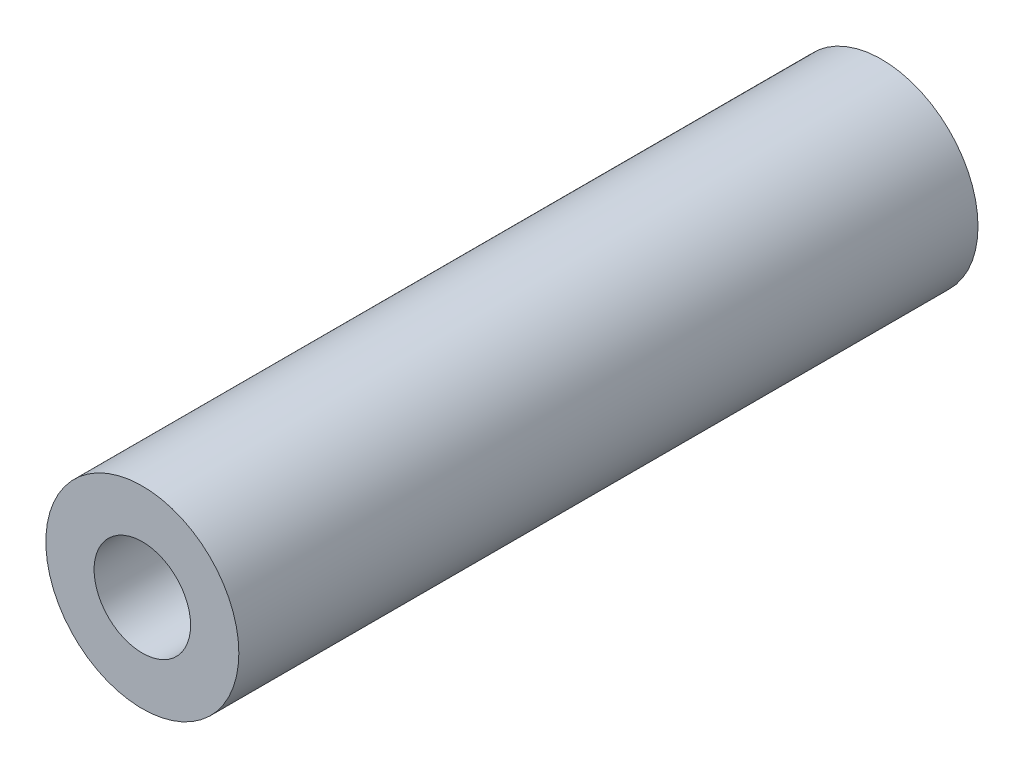
ISO-10303-21;
HEADER;
FILE_DESCRIPTION(('STEP AP214'),'2;1');
FILE_NAME('part.step','',(''),(''),'','','');
FILE_SCHEMA(('AUTOMOTIVE_DESIGN { 1 0 10303 214 1 1 1 1 }'));
ENDSEC;
DATA;
#1=APPLICATION_CONTEXT('core data for automotive mechanical design processes');
#2=APPLICATION_PROTOCOL_DEFINITION('international standard','automotive_design',2000,#1);
#3=PRODUCT_CONTEXT('',#1,'mechanical');
#4=PRODUCT('Part','Part','',(#3));
#5=PRODUCT_RELATED_PRODUCT_CATEGORY('part','',(#4));
#6=PRODUCT_DEFINITION_FORMATION('','',#4);
#7=PRODUCT_DEFINITION_CONTEXT('part definition',#1,'design');
#8=PRODUCT_DEFINITION('design','',#6,#7);
#9=PRODUCT_DEFINITION_SHAPE('','',#8);
#10=(LENGTH_UNIT() NAMED_UNIT(*) SI_UNIT(.MILLI.,.METRE.));
#11=(NAMED_UNIT(*) PLANE_ANGLE_UNIT() SI_UNIT($,.RADIAN.));
#12=(NAMED_UNIT(*) SI_UNIT($,.STERADIAN.) SOLID_ANGLE_UNIT());
#13=UNCERTAINTY_MEASURE_WITH_UNIT(LENGTH_MEASURE(1.E-05),#10,'distance_accuracy_value','');
#14=(GEOMETRIC_REPRESENTATION_CONTEXT(3) GLOBAL_UNCERTAINTY_ASSIGNED_CONTEXT((#13)) GLOBAL_UNIT_ASSIGNED_CONTEXT((#10,
#11,#12)) REPRESENTATION_CONTEXT('',''));
#15=CARTESIAN_POINT('',(0.,0.,0.));
#16=DIRECTION('',(0.,0.,1.));
#17=DIRECTION('',(1.,0.,0.));
#18=AXIS2_PLACEMENT_3D('',#15,#16,#17);
#19=CARTESIAN_POINT('',(0.,0.,9.575));
#20=DIRECTION('',(0.,0.,-1.));
#21=DIRECTION('',(-1.,0.,0.));
#22=AXIS2_PLACEMENT_3D('',#19,#20,#21);
#23=CYLINDRICAL_SURFACE('',#22,2.5);
#24=CARTESIAN_POINT('',(0.,0.,9.575));
#25=DIRECTION('',(0.,0.,1.));
#26=DIRECTION('',(1.,0.,0.));
#27=AXIS2_PLACEMENT_3D('',#24,#25,#26);
#28=CIRCLE('',#27,2.5);
#29=CARTESIAN_POINT('',(2.5,0.,9.575));
#30=VERTEX_POINT('',#29);
#31=EDGE_CURVE('E10',#30,#30,#28,.T.);
#32=ORIENTED_EDGE('',*,*,#31,.F.);
#33=EDGE_LOOP('',(#32));
#34=FACE_BOUND('',#33,.T.);
#35=CARTESIAN_POINT('',(0.,0.,-9.575));
#36=DIRECTION('',(0.,0.,1.));
#37=DIRECTION('',(1.,0.,0.));
#38=AXIS2_PLACEMENT_3D('',#35,#36,#37);
#39=CIRCLE('',#38,2.5);
#40=CARTESIAN_POINT('',(2.5,0.,-9.575));
#41=VERTEX_POINT('',#40);
#42=EDGE_CURVE('E50',#41,#41,#39,.T.);
#43=ORIENTED_EDGE('',*,*,#42,.T.);
#44=EDGE_LOOP('',(#43));
#45=FACE_BOUND('',#44,.T.);
#46=ADVANCED_FACE('F47',(#34,#45),#23,.T.);
#47=CARTESIAN_POINT('',(0.,0.,9.575));
#48=DIRECTION('',(0.,0.,1.));
#49=DIRECTION('',(1.,0.,0.));
#50=AXIS2_PLACEMENT_3D('',#47,#48,#49);
#51=PLANE('',#50);
#52=CARTESIAN_POINT('',(0.,0.,9.575));
#53=DIRECTION('',(0.,0.,1.));
#54=DIRECTION('',(1.,0.,0.));
#55=AXIS2_PLACEMENT_3D('',#52,#53,#54);
#56=CIRCLE('',#55,1.24999999999999);
#57=CARTESIAN_POINT('',(1.24999999999999,0.,9.575));
#58=VERTEX_POINT('',#57);
#59=EDGE_CURVE('E59',#58,#58,#56,.T.);
#60=ORIENTED_EDGE('',*,*,#59,.F.);
#61=EDGE_LOOP('',(#60));
#62=FACE_BOUND('',#61,.T.);
#63=ORIENTED_EDGE('',*,*,#31,.T.);
#64=EDGE_LOOP('',(#63));
#65=FACE_BOUND('',#64,.T.);
#66=ADVANCED_FACE('F74',(#62,#65),#51,.T.);
#67=CARTESIAN_POINT('',(0.,0.,-9.575));
#68=DIRECTION('',(0.,0.,1.));
#69=DIRECTION('',(1.,0.,0.));
#70=AXIS2_PLACEMENT_3D('',#67,#68,#69);
#71=PLANE('',#70);
#72=CARTESIAN_POINT('',(0.,0.,-9.575));
#73=DIRECTION('',(0.,0.,-1.));
#74=DIRECTION('',(-1.,0.,0.));
#75=AXIS2_PLACEMENT_3D('',#72,#73,#74);
#76=CIRCLE('',#75,1.24999999999999);
#77=CARTESIAN_POINT('',(-1.24999999999999,0.,-9.575));
#78=VERTEX_POINT('',#77);
#79=EDGE_CURVE('E64',#78,#78,#76,.T.);
#80=ORIENTED_EDGE('',*,*,#79,.F.);
#81=EDGE_LOOP('',(#80));
#82=FACE_BOUND('',#81,.T.);
#83=ORIENTED_EDGE('',*,*,#42,.F.);
#84=EDGE_LOOP('',(#83));
#85=FACE_BOUND('',#84,.T.);
#86=ADVANCED_FACE('F71',(#82,#85),#71,.F.);
#87=CARTESIAN_POINT('',(0.,0.,9.575));
#88=DIRECTION('',(0.,0.,1.));
#89=DIRECTION('',(1.,0.,0.));
#90=AXIS2_PLACEMENT_3D('',#87,#88,#89);
#91=CYLINDRICAL_SURFACE('',#90,1.24999999999999);
#92=ORIENTED_EDGE('',*,*,#59,.T.);
#93=EDGE_LOOP('',(#92));
#94=FACE_BOUND('',#93,.T.);
#95=ORIENTED_EDGE('',*,*,#79,.T.);
#96=EDGE_LOOP('',(#95));
#97=FACE_BOUND('',#96,.T.);
#98=ADVANCED_FACE('F69',(#94,#97),#91,.F.);
#99=CLOSED_SHELL('',(#46,#66,#86,#98));
#100=MANIFOLD_SOLID_BREP('B2',#99);
#101=ADVANCED_BREP_SHAPE_REPRESENTATION('',(#18,#100),#14);
#102=SHAPE_DEFINITION_REPRESENTATION(#9,#101);
ENDSEC;
END-ISO-10303-21;
